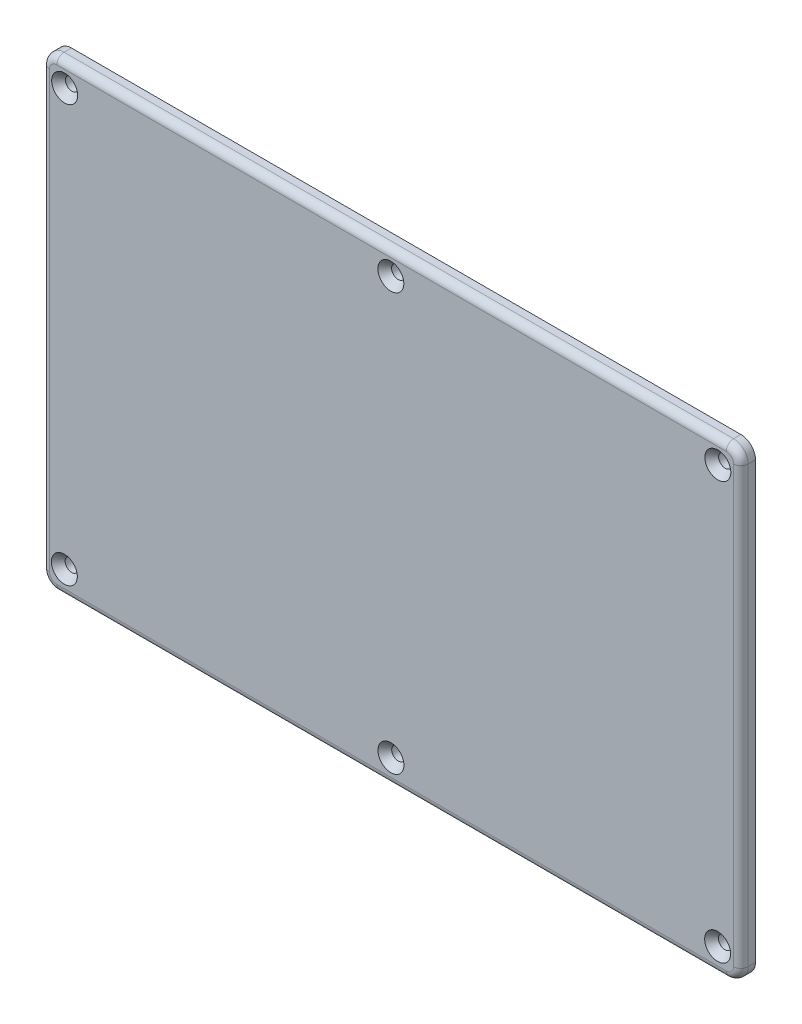
ISO-10303-21;
HEADER;
FILE_DESCRIPTION(('STEP AP214'),'2;1');
FILE_NAME('part.step','',(''),(''),'','','');
FILE_SCHEMA(('AUTOMOTIVE_DESIGN { 1 0 10303 214 1 1 1 1 }'));
ENDSEC;
DATA;
#1=APPLICATION_CONTEXT('core data for automotive mechanical design processes');
#2=APPLICATION_PROTOCOL_DEFINITION('international standard','automotive_design',2000,#1);
#3=PRODUCT_CONTEXT('',#1,'mechanical');
#4=PRODUCT('Part','Part','',(#3));
#5=PRODUCT_RELATED_PRODUCT_CATEGORY('part','',(#4));
#6=PRODUCT_DEFINITION_FORMATION('','',#4);
#7=PRODUCT_DEFINITION_CONTEXT('part definition',#1,'design');
#8=PRODUCT_DEFINITION('design','',#6,#7);
#9=PRODUCT_DEFINITION_SHAPE('','',#8);
#10=(LENGTH_UNIT() NAMED_UNIT(*) SI_UNIT(.MILLI.,.METRE.));
#11=(NAMED_UNIT(*) PLANE_ANGLE_UNIT() SI_UNIT($,.RADIAN.));
#12=(NAMED_UNIT(*) SI_UNIT($,.STERADIAN.) SOLID_ANGLE_UNIT());
#13=UNCERTAINTY_MEASURE_WITH_UNIT(LENGTH_MEASURE(1.E-05),#10,'distance_accuracy_value','');
#14=(GEOMETRIC_REPRESENTATION_CONTEXT(3) GLOBAL_UNCERTAINTY_ASSIGNED_CONTEXT((#13)) GLOBAL_UNIT_ASSIGNED_CONTEXT((#10,
#11,#12)) REPRESENTATION_CONTEXT('',''));
#15=CARTESIAN_POINT('',(0.,0.,0.));
#16=DIRECTION('',(0.,0.,1.));
#17=DIRECTION('',(1.,0.,0.));
#18=AXIS2_PLACEMENT_3D('',#15,#16,#17);
#19=CARTESIAN_POINT('',(95.5,63.5,4.));
#20=DIRECTION('',(-1.,0.,0.));
#21=DIRECTION('',(0.,-1.,0.));
#22=AXIS2_PLACEMENT_3D('',#19,#20,#21);
#23=PLANE('',#22);
#24=DIRECTION('',(0.,0.,-1.));
#25=VECTOR('',#24,1.);
#26=CARTESIAN_POINT('',(95.5,59.5,4.));
#27=LINE('',#26,#25);
#28=CARTESIAN_POINT('',(95.5,59.5,0.));
#29=VERTEX_POINT('',#28);
#30=CARTESIAN_POINT('',(95.5,59.5,2.));
#31=VERTEX_POINT('',#30);
#32=EDGE_CURVE('E232',#29,#31,#27,.F.);
#33=ORIENTED_EDGE('',*,*,#32,.T.);
#34=DIRECTION('',(0.,1.,0.));
#35=VECTOR('',#34,1.);
#36=CARTESIAN_POINT('',(95.5,-59.5,2.));
#37=LINE('',#36,#35);
#38=CARTESIAN_POINT('',(95.5,-59.5,2.));
#39=VERTEX_POINT('',#38);
#40=EDGE_CURVE('E66',#31,#39,#37,.F.);
#41=ORIENTED_EDGE('',*,*,#40,.T.);
#42=DIRECTION('',(0.,0.,-1.));
#43=VECTOR('',#42,1.);
#44=CARTESIAN_POINT('',(95.5,-59.5,4.));
#45=LINE('',#44,#43);
#46=CARTESIAN_POINT('',(95.5,-59.5,0.));
#47=VERTEX_POINT('',#46);
#48=EDGE_CURVE('E229',#39,#47,#45,.T.);
#49=ORIENTED_EDGE('',*,*,#48,.T.);
#50=DIRECTION('',(0.,1.,0.));
#51=VECTOR('',#50,1.);
#52=CARTESIAN_POINT('',(95.5,63.5,0.));
#53=LINE('',#52,#51);
#54=EDGE_CURVE('E171',#47,#29,#53,.T.);
#55=ORIENTED_EDGE('',*,*,#54,.T.);
#56=EDGE_LOOP('',(#33,#41,#49,#55));
#57=FACE_BOUND('',#56,.T.);
#58=ADVANCED_FACE('F41',(#57),#23,.F.);
#59=CARTESIAN_POINT('',(-95.5,63.5,4.));
#60=DIRECTION('',(0.,-1.,0.));
#61=DIRECTION('',(0.,0.,-1.));
#62=AXIS2_PLACEMENT_3D('',#59,#60,#61);
#63=PLANE('',#62);
#64=DIRECTION('',(0.,0.,-1.));
#65=VECTOR('',#64,1.);
#66=CARTESIAN_POINT('',(-91.5,63.5,4.));
#67=LINE('',#66,#65);
#68=CARTESIAN_POINT('',(-91.5,63.5,0.));
#69=VERTEX_POINT('',#68);
#70=CARTESIAN_POINT('',(-91.5,63.5,2.));
#71=VERTEX_POINT('',#70);
#72=EDGE_CURVE('E152',#69,#71,#67,.F.);
#73=ORIENTED_EDGE('',*,*,#72,.T.);
#74=DIRECTION('',(-1.,0.,0.));
#75=VECTOR('',#74,1.);
#76=CARTESIAN_POINT('',(91.5,63.5,2.));
#77=LINE('',#76,#75);
#78=CARTESIAN_POINT('',(91.5,63.5,2.));
#79=VERTEX_POINT('',#78);
#80=EDGE_CURVE('E269',#71,#79,#77,.F.);
#81=ORIENTED_EDGE('',*,*,#80,.T.);
#82=DIRECTION('',(0.,0.,-1.));
#83=VECTOR('',#82,1.);
#84=CARTESIAN_POINT('',(91.5,63.5,4.));
#85=LINE('',#84,#83);
#86=CARTESIAN_POINT('',(91.5,63.5,0.));
#87=VERTEX_POINT('',#86);
#88=EDGE_CURVE('E157',#79,#87,#85,.T.);
#89=ORIENTED_EDGE('',*,*,#88,.T.);
#90=DIRECTION('',(-1.,0.,0.));
#91=VECTOR('',#90,1.);
#92=CARTESIAN_POINT('',(-95.5,63.5,0.));
#93=LINE('',#92,#91);
#94=EDGE_CURVE('E165',#87,#69,#93,.T.);
#95=ORIENTED_EDGE('',*,*,#94,.T.);
#96=EDGE_LOOP('',(#73,#81,#89,#95));
#97=FACE_BOUND('',#96,.T.);
#98=ADVANCED_FACE('F393',(#97),#63,.F.);
#99=CARTESIAN_POINT('',(-95.5,63.5,4.));
#100=DIRECTION('',(1.,0.,0.));
#101=DIRECTION('',(0.,1.,0.));
#102=AXIS2_PLACEMENT_3D('',#99,#100,#101);
#103=PLANE('',#102);
#104=DIRECTION('',(0.,0.,-1.));
#105=VECTOR('',#104,1.);
#106=CARTESIAN_POINT('',(-95.5,-59.5,4.));
#107=LINE('',#106,#105);
#108=CARTESIAN_POINT('',(-95.5,-59.5,0.));
#109=VERTEX_POINT('',#108);
#110=CARTESIAN_POINT('',(-95.5,-59.5,2.));
#111=VERTEX_POINT('',#110);
#112=EDGE_CURVE('E146',#109,#111,#107,.F.);
#113=ORIENTED_EDGE('',*,*,#112,.T.);
#114=DIRECTION('',(0.,-1.,0.));
#115=VECTOR('',#114,1.);
#116=CARTESIAN_POINT('',(-95.5,59.5,2.));
#117=LINE('',#116,#115);
#118=CARTESIAN_POINT('',(-95.5,59.5,2.));
#119=VERTEX_POINT('',#118);
#120=EDGE_CURVE('E141',#111,#119,#117,.F.);
#121=ORIENTED_EDGE('',*,*,#120,.T.);
#122=DIRECTION('',(0.,0.,-1.));
#123=VECTOR('',#122,1.);
#124=CARTESIAN_POINT('',(-95.5,59.5,4.));
#125=LINE('',#124,#123);
#126=CARTESIAN_POINT('',(-95.5,59.5,0.));
#127=VERTEX_POINT('',#126);
#128=EDGE_CURVE('E133',#119,#127,#125,.T.);
#129=ORIENTED_EDGE('',*,*,#128,.T.);
#130=DIRECTION('',(0.,-1.,0.));
#131=VECTOR('',#130,1.);
#132=CARTESIAN_POINT('',(-95.5,63.5,0.));
#133=LINE('',#132,#131);
#134=EDGE_CURVE('E138',#127,#109,#133,.T.);
#135=ORIENTED_EDGE('',*,*,#134,.T.);
#136=EDGE_LOOP('',(#113,#121,#129,#135));
#137=FACE_BOUND('',#136,.T.);
#138=ADVANCED_FACE('F136',(#137),#103,.F.);
#139=CARTESIAN_POINT('',(-95.5,-63.5,4.));
#140=DIRECTION('',(0.,1.,0.));
#141=DIRECTION('',(0.,0.,1.));
#142=AXIS2_PLACEMENT_3D('',#139,#140,#141);
#143=PLANE('',#142);
#144=DIRECTION('',(0.,0.,-1.));
#145=VECTOR('',#144,1.);
#146=CARTESIAN_POINT('',(91.5,-63.5,4.));
#147=LINE('',#146,#145);
#148=CARTESIAN_POINT('',(91.5,-63.5,0.));
#149=VERTEX_POINT('',#148);
#150=CARTESIAN_POINT('',(91.5,-63.5,2.));
#151=VERTEX_POINT('',#150);
#152=EDGE_CURVE('E223',#149,#151,#147,.F.);
#153=ORIENTED_EDGE('',*,*,#152,.T.);
#154=DIRECTION('',(1.,0.,0.));
#155=VECTOR('',#154,1.);
#156=CARTESIAN_POINT('',(-91.5,-63.5,2.));
#157=LINE('',#156,#155);
#158=CARTESIAN_POINT('',(-91.5,-63.5,2.));
#159=VERTEX_POINT('',#158);
#160=EDGE_CURVE('E11',#151,#159,#157,.F.);
#161=ORIENTED_EDGE('',*,*,#160,.T.);
#162=DIRECTION('',(0.,0.,-1.));
#163=VECTOR('',#162,1.);
#164=CARTESIAN_POINT('',(-91.5,-63.5,4.));
#165=LINE('',#164,#163);
#166=CARTESIAN_POINT('',(-91.5,-63.5,0.));
#167=VERTEX_POINT('',#166);
#168=EDGE_CURVE('E226',#159,#167,#165,.T.);
#169=ORIENTED_EDGE('',*,*,#168,.T.);
#170=DIRECTION('',(1.,0.,0.));
#171=VECTOR('',#170,1.);
#172=CARTESIAN_POINT('',(-95.5,-63.5,0.));
#173=LINE('',#172,#171);
#174=EDGE_CURVE('E164',#167,#149,#173,.T.);
#175=ORIENTED_EDGE('',*,*,#174,.T.);
#176=EDGE_LOOP('',(#153,#161,#169,#175));
#177=FACE_BOUND('',#176,.T.);
#178=ADVANCED_FACE('F376',(#177),#143,.F.);
#179=CARTESIAN_POINT('',(0.,0.,4.));
#180=DIRECTION('',(0.,0.,1.));
#181=DIRECTION('',(1.,0.,0.));
#182=AXIS2_PLACEMENT_3D('',#179,#180,#181);
#183=PLANE('',#182);
#184=DIRECTION('',(0.,-1.,0.));
#185=VECTOR('',#184,1.);
#186=CARTESIAN_POINT('',(-93.5,-59.5,4.));
#187=LINE('',#186,#185);
#188=CARTESIAN_POINT('',(-93.5,59.5,4.));
#189=VERTEX_POINT('',#188);
#190=CARTESIAN_POINT('',(-93.5,-59.5,4.));
#191=VERTEX_POINT('',#190);
#192=EDGE_CURVE('E253',#189,#191,#187,.T.);
#193=ORIENTED_EDGE('',*,*,#192,.T.);
#194=CARTESIAN_POINT('',(-91.5,-59.5,4.));
#195=DIRECTION('',(0.,0.,1.));
#196=DIRECTION('',(1.,0.,0.));
#197=AXIS2_PLACEMENT_3D('',#194,#195,#196);
#198=CIRCLE('',#197,2.);
#199=CARTESIAN_POINT('',(-91.5,-61.5,4.));
#200=VERTEX_POINT('',#199);
#201=EDGE_CURVE('E256',#191,#200,#198,.T.);
#202=ORIENTED_EDGE('',*,*,#201,.T.);
#203=DIRECTION('',(1.,0.,0.));
#204=VECTOR('',#203,1.);
#205=CARTESIAN_POINT('',(91.5,-61.5,4.));
#206=LINE('',#205,#204);
#207=CARTESIAN_POINT('',(91.5,-61.5,4.));
#208=VERTEX_POINT('',#207);
#209=EDGE_CURVE('E235',#200,#208,#206,.T.);
#210=ORIENTED_EDGE('',*,*,#209,.T.);
#211=CARTESIAN_POINT('',(91.5,-59.5,4.));
#212=DIRECTION('',(0.,0.,1.));
#213=DIRECTION('',(1.,0.,0.));
#214=AXIS2_PLACEMENT_3D('',#211,#212,#213);
#215=CIRCLE('',#214,2.);
#216=CARTESIAN_POINT('',(93.5,-59.5,4.));
#217=VERTEX_POINT('',#216);
#218=EDGE_CURVE('E238',#208,#217,#215,.T.);
#219=ORIENTED_EDGE('',*,*,#218,.T.);
#220=DIRECTION('',(0.,1.,0.));
#221=VECTOR('',#220,1.);
#222=CARTESIAN_POINT('',(93.5,59.5,4.));
#223=LINE('',#222,#221);
#224=CARTESIAN_POINT('',(93.5,59.5,4.));
#225=VERTEX_POINT('',#224);
#226=EDGE_CURVE('E241',#217,#225,#223,.T.);
#227=ORIENTED_EDGE('',*,*,#226,.T.);
#228=CARTESIAN_POINT('',(91.5,59.5,4.));
#229=DIRECTION('',(0.,0.,1.));
#230=DIRECTION('',(1.,0.,0.));
#231=AXIS2_PLACEMENT_3D('',#228,#229,#230);
#232=CIRCLE('',#231,2.);
#233=CARTESIAN_POINT('',(91.5,61.5,4.));
#234=VERTEX_POINT('',#233);
#235=EDGE_CURVE('E244',#225,#234,#232,.T.);
#236=ORIENTED_EDGE('',*,*,#235,.T.);
#237=DIRECTION('',(-1.,0.,0.));
#238=VECTOR('',#237,1.);
#239=CARTESIAN_POINT('',(-91.5,61.5,4.));
#240=LINE('',#239,#238);
#241=CARTESIAN_POINT('',(-91.5,61.5,4.));
#242=VERTEX_POINT('',#241);
#243=EDGE_CURVE('E247',#234,#242,#240,.T.);
#244=ORIENTED_EDGE('',*,*,#243,.T.);
#245=CARTESIAN_POINT('',(-91.5,59.5,4.));
#246=DIRECTION('',(0.,0.,1.));
#247=DIRECTION('',(1.,0.,0.));
#248=AXIS2_PLACEMENT_3D('',#245,#246,#247);
#249=CIRCLE('',#248,2.);
#250=EDGE_CURVE('E250',#242,#189,#249,.T.);
#251=ORIENTED_EDGE('',*,*,#250,.T.);
#252=EDGE_LOOP('',(#193,#202,#210,#219,#227,#236,#244,#251));
#253=FACE_BOUND('',#252,.T.);
#254=CARTESIAN_POINT('',(-89.3585629023435,57.0955798056189,4.));
#255=DIRECTION('',(0.,0.,1.));
#256=DIRECTION('',(1.,0.,0.));
#257=AXIS2_PLACEMENT_3D('',#254,#255,#256);
#258=CIRCLE('',#257,3.55);
#259=CARTESIAN_POINT('',(-85.8085629023435,57.0955798056189,4.));
#260=VERTEX_POINT('',#259);
#261=EDGE_CURVE('E308',#260,#260,#258,.T.);
#262=ORIENTED_EDGE('',*,*,#261,.F.);
#263=EDGE_LOOP('',(#262));
#264=FACE_BOUND('',#263,.T.);
#265=CARTESIAN_POINT('',(-0.19173029885108,57.1256881937207,4.));
#266=DIRECTION('',(0.,0.,1.));
#267=DIRECTION('',(1.,0.,0.));
#268=AXIS2_PLACEMENT_3D('',#265,#266,#267);
#269=CIRCLE('',#268,3.55);
#270=CARTESIAN_POINT('',(3.35826970114892,57.1256881937207,4.));
#271=VERTEX_POINT('',#270);
#272=EDGE_CURVE('E208',#271,#271,#269,.T.);
#273=ORIENTED_EDGE('',*,*,#272,.F.);
#274=EDGE_LOOP('',(#273));
#275=FACE_BOUND('',#274,.T.);
#276=CARTESIAN_POINT('',(89.2052171585333,57.1455159036048,4.));
#277=DIRECTION('',(0.,0.,1.));
#278=DIRECTION('',(1.,0.,0.));
#279=AXIS2_PLACEMENT_3D('',#276,#277,#278);
#280=CIRCLE('',#279,3.55);
#281=CARTESIAN_POINT('',(92.7552171585333,57.1455159036048,4.));
#282=VERTEX_POINT('',#281);
#283=EDGE_CURVE('E202',#282,#282,#280,.T.);
#284=ORIENTED_EDGE('',*,*,#283,.F.);
#285=EDGE_LOOP('',(#284));
#286=FACE_BOUND('',#285,.T.);
#287=CARTESIAN_POINT('',(89.1478229110666,-56.8820145222905,4.));
#288=DIRECTION('',(0.,0.,1.));
#289=DIRECTION('',(1.,0.,0.));
#290=AXIS2_PLACEMENT_3D('',#287,#288,#289);
#291=CIRCLE('',#290,3.55);
#292=CARTESIAN_POINT('',(92.6978229110666,-56.8820145222905,4.));
#293=VERTEX_POINT('',#292);
#294=EDGE_CURVE('E196',#293,#293,#291,.T.);
#295=ORIENTED_EDGE('',*,*,#294,.F.);
#296=EDGE_LOOP('',(#295));
#297=FACE_BOUND('',#296,.T.);
#298=CARTESIAN_POINT('',(-0.160812966057601,-56.856544367549,4.));
#299=DIRECTION('',(0.,0.,1.));
#300=DIRECTION('',(1.,0.,0.));
#301=AXIS2_PLACEMENT_3D('',#298,#299,#300);
#302=CIRCLE('',#301,3.55);
#303=CARTESIAN_POINT('',(3.3891870339424,-56.856544367549,4.));
#304=VERTEX_POINT('',#303);
#305=EDGE_CURVE('E190',#304,#304,#302,.T.);
#306=ORIENTED_EDGE('',*,*,#305,.F.);
#307=EDGE_LOOP('',(#306));
#308=FACE_BOUND('',#307,.T.);
#309=CARTESIAN_POINT('',(-89.4443328690032,-56.8623922152166,4.));
#310=DIRECTION('',(0.,0.,1.));
#311=DIRECTION('',(1.,0.,0.));
#312=AXIS2_PLACEMENT_3D('',#309,#310,#311);
#313=CIRCLE('',#312,3.55);
#314=CARTESIAN_POINT('',(-85.8943328690032,-56.8623922152166,4.));
#315=VERTEX_POINT('',#314);
#316=EDGE_CURVE('E184',#315,#315,#313,.T.);
#317=ORIENTED_EDGE('',*,*,#316,.F.);
#318=EDGE_LOOP('',(#317));
#319=FACE_BOUND('',#318,.T.);
#320=ADVANCED_FACE('F396',(#253,#264,#275,#286,#297,#308,#319),#183,.T.);
#321=CARTESIAN_POINT('',(0.,0.,0.));
#322=DIRECTION('',(0.,0.,1.));
#323=DIRECTION('',(1.,0.,0.));
#324=AXIS2_PLACEMENT_3D('',#321,#322,#323);
#325=PLANE('',#324);
#326=CARTESIAN_POINT('',(-89.3585629023435,57.0955798056189,0.));
#327=DIRECTION('',(0.,0.,1.));
#328=DIRECTION('',(1.,0.,0.));
#329=AXIS2_PLACEMENT_3D('',#326,#327,#328);
#330=CIRCLE('',#329,1.8);
#331=CARTESIAN_POINT('',(-87.5585629023435,57.0955798056189,0.));
#332=VERTEX_POINT('',#331);
#333=EDGE_CURVE('E204',#332,#332,#330,.T.);
#334=ORIENTED_EDGE('',*,*,#333,.T.);
#335=EDGE_LOOP('',(#334));
#336=FACE_BOUND('',#335,.T.);
#337=CARTESIAN_POINT('',(-0.19173029885108,57.1256881937207,0.));
#338=DIRECTION('',(0.,0.,1.));
#339=DIRECTION('',(1.,0.,0.));
#340=AXIS2_PLACEMENT_3D('',#337,#338,#339);
#341=CIRCLE('',#340,1.8);
#342=CARTESIAN_POINT('',(1.60826970114892,57.1256881937207,0.));
#343=VERTEX_POINT('',#342);
#344=EDGE_CURVE('E198',#343,#343,#341,.T.);
#345=ORIENTED_EDGE('',*,*,#344,.T.);
#346=EDGE_LOOP('',(#345));
#347=FACE_BOUND('',#346,.T.);
#348=CARTESIAN_POINT('',(89.2052171585333,57.1455159036048,0.));
#349=DIRECTION('',(0.,0.,1.));
#350=DIRECTION('',(1.,0.,0.));
#351=AXIS2_PLACEMENT_3D('',#348,#349,#350);
#352=CIRCLE('',#351,1.8);
#353=CARTESIAN_POINT('',(91.0052171585333,57.1455159036048,0.));
#354=VERTEX_POINT('',#353);
#355=EDGE_CURVE('E192',#354,#354,#352,.T.);
#356=ORIENTED_EDGE('',*,*,#355,.T.);
#357=EDGE_LOOP('',(#356));
#358=FACE_BOUND('',#357,.T.);
#359=CARTESIAN_POINT('',(89.1478229110666,-56.8820145222905,0.));
#360=DIRECTION('',(0.,0.,1.));
#361=DIRECTION('',(1.,0.,0.));
#362=AXIS2_PLACEMENT_3D('',#359,#360,#361);
#363=CIRCLE('',#362,1.8);
#364=CARTESIAN_POINT('',(90.9478229110666,-56.8820145222905,0.));
#365=VERTEX_POINT('',#364);
#366=EDGE_CURVE('E186',#365,#365,#363,.T.);
#367=ORIENTED_EDGE('',*,*,#366,.T.);
#368=EDGE_LOOP('',(#367));
#369=FACE_BOUND('',#368,.T.);
#370=CARTESIAN_POINT('',(-0.160812966057601,-56.856544367549,0.));
#371=DIRECTION('',(0.,0.,1.));
#372=DIRECTION('',(1.,0.,0.));
#373=AXIS2_PLACEMENT_3D('',#370,#371,#372);
#374=CIRCLE('',#373,1.8);
#375=CARTESIAN_POINT('',(1.6391870339424,-56.856544367549,0.));
#376=VERTEX_POINT('',#375);
#377=EDGE_CURVE('E180',#376,#376,#374,.T.);
#378=ORIENTED_EDGE('',*,*,#377,.T.);
#379=EDGE_LOOP('',(#378));
#380=FACE_BOUND('',#379,.T.);
#381=CARTESIAN_POINT('',(-89.4443328690032,-56.8623922152166,0.));
#382=DIRECTION('',(0.,0.,1.));
#383=DIRECTION('',(1.,0.,0.));
#384=AXIS2_PLACEMENT_3D('',#381,#382,#383);
#385=CIRCLE('',#384,1.8);
#386=CARTESIAN_POINT('',(-87.6443328690032,-56.8623922152166,0.));
#387=VERTEX_POINT('',#386);
#388=EDGE_CURVE('E175',#387,#387,#385,.T.);
#389=ORIENTED_EDGE('',*,*,#388,.T.);
#390=EDGE_LOOP('',(#389));
#391=FACE_BOUND('',#390,.T.);
#392=ORIENTED_EDGE('',*,*,#134,.F.);
#393=CARTESIAN_POINT('',(-91.5,59.5,0.));
#394=DIRECTION('',(0.,0.,1.));
#395=DIRECTION('',(1.,0.,0.));
#396=AXIS2_PLACEMENT_3D('',#393,#394,#395);
#397=CIRCLE('',#396,4.);
#398=EDGE_CURVE('E149',#127,#69,#397,.F.);
#399=ORIENTED_EDGE('',*,*,#398,.T.);
#400=ORIENTED_EDGE('',*,*,#94,.F.);
#401=CARTESIAN_POINT('',(91.5,59.5,0.));
#402=DIRECTION('',(0.,0.,1.));
#403=DIRECTION('',(1.,0.,0.));
#404=AXIS2_PLACEMENT_3D('',#401,#402,#403);
#405=CIRCLE('',#404,4.);
#406=EDGE_CURVE('E214',#87,#29,#405,.F.);
#407=ORIENTED_EDGE('',*,*,#406,.T.);
#408=ORIENTED_EDGE('',*,*,#54,.F.);
#409=CARTESIAN_POINT('',(91.5,-59.5,0.));
#410=DIRECTION('',(0.,0.,1.));
#411=DIRECTION('',(1.,0.,0.));
#412=AXIS2_PLACEMENT_3D('',#409,#410,#411);
#413=CIRCLE('',#412,4.);
#414=EDGE_CURVE('E145',#47,#149,#413,.F.);
#415=ORIENTED_EDGE('',*,*,#414,.T.);
#416=ORIENTED_EDGE('',*,*,#174,.F.);
#417=CARTESIAN_POINT('',(-91.5,-59.5,0.));
#418=DIRECTION('',(0.,0.,1.));
#419=DIRECTION('',(1.,0.,0.));
#420=AXIS2_PLACEMENT_3D('',#417,#418,#419);
#421=CIRCLE('',#420,4.);
#422=EDGE_CURVE('E158',#167,#109,#421,.F.);
#423=ORIENTED_EDGE('',*,*,#422,.T.);
#424=EDGE_LOOP('',(#392,#399,#400,#407,#408,#415,#416,#423));
#425=FACE_BOUND('',#424,.T.);
#426=ADVANCED_FACE('F160',(#336,#347,#358,#369,#380,#391,#425),#325,.F.);
#427=CARTESIAN_POINT('',(-89.4443328690032,-56.8623922152166,4.));
#428=DIRECTION('',(0.,0.,1.));
#429=DIRECTION('',(1.,0.,0.));
#430=AXIS2_PLACEMENT_3D('',#427,#428,#429);
#431=CYLINDRICAL_SURFACE('',#430,1.8);
#432=CARTESIAN_POINT('',(-89.4443328690032,-56.8623922152166,1.98685528736325));
#433=DIRECTION('',(0.,0.,1.));
#434=DIRECTION('',(1.,0.,0.));
#435=AXIS2_PLACEMENT_3D('',#432,#433,#434);
#436=CIRCLE('',#435,1.8);
#437=CARTESIAN_POINT('',(-87.6443328690032,-56.8623922152166,1.98685528736325));
#438=VERTEX_POINT('',#437);
#439=EDGE_CURVE('E179',#438,#438,#436,.T.);
#440=ORIENTED_EDGE('',*,*,#439,.T.);
#441=EDGE_LOOP('',(#440));
#442=FACE_BOUND('',#441,.T.);
#443=ORIENTED_EDGE('',*,*,#388,.F.);
#444=EDGE_LOOP('',(#443));
#445=FACE_BOUND('',#444,.T.);
#446=ADVANCED_FACE('F414',(#442,#445),#431,.F.);
#447=CARTESIAN_POINT('',(-89.4443328690032,-56.8623922152166,4.));
#448=DIRECTION('',(0.,0.,1.));
#449=DIRECTION('',(1.,0.,0.));
#450=AXIS2_PLACEMENT_3D('',#447,#448,#449);
#451=CONICAL_SURFACE('',#450,3.55,0.715584993317678);
#452=ORIENTED_EDGE('',*,*,#439,.F.);
#453=EDGE_LOOP('',(#452));
#454=FACE_BOUND('',#453,.T.);
#455=ORIENTED_EDGE('',*,*,#316,.T.);
#456=EDGE_LOOP('',(#455));
#457=FACE_BOUND('',#456,.T.);
#458=ADVANCED_FACE('F411',(#454,#457),#451,.F.);
#459=CARTESIAN_POINT('',(-0.160812966057601,-56.856544367549,4.));
#460=DIRECTION('',(0.,0.,1.));
#461=DIRECTION('',(1.,0.,0.));
#462=AXIS2_PLACEMENT_3D('',#459,#460,#461);
#463=CYLINDRICAL_SURFACE('',#462,1.8);
#464=CARTESIAN_POINT('',(-0.160812966057601,-56.856544367549,1.98685528736325));
#465=DIRECTION('',(0.,0.,1.));
#466=DIRECTION('',(1.,0.,0.));
#467=AXIS2_PLACEMENT_3D('',#464,#465,#466);
#468=CIRCLE('',#467,1.8);
#469=CARTESIAN_POINT('',(1.6391870339424,-56.856544367549,1.98685528736325));
#470=VERTEX_POINT('',#469);
#471=EDGE_CURVE('E185',#470,#470,#468,.T.);
#472=ORIENTED_EDGE('',*,*,#471,.T.);
#473=EDGE_LOOP('',(#472));
#474=FACE_BOUND('',#473,.T.);
#475=ORIENTED_EDGE('',*,*,#377,.F.);
#476=EDGE_LOOP('',(#475));
#477=FACE_BOUND('',#476,.T.);
#478=ADVANCED_FACE('F413',(#474,#477),#463,.F.);
#479=CARTESIAN_POINT('',(-0.160812966057601,-56.856544367549,4.));
#480=DIRECTION('',(0.,0.,1.));
#481=DIRECTION('',(1.,0.,0.));
#482=AXIS2_PLACEMENT_3D('',#479,#480,#481);
#483=CONICAL_SURFACE('',#482,3.55,0.715584993317678);
#484=ORIENTED_EDGE('',*,*,#471,.F.);
#485=EDGE_LOOP('',(#484));
#486=FACE_BOUND('',#485,.T.);
#487=ORIENTED_EDGE('',*,*,#305,.T.);
#488=EDGE_LOOP('',(#487));
#489=FACE_BOUND('',#488,.T.);
#490=ADVANCED_FACE('F421',(#486,#489),#483,.F.);
#491=CARTESIAN_POINT('',(89.1478229110666,-56.8820145222905,4.));
#492=DIRECTION('',(0.,0.,1.));
#493=DIRECTION('',(1.,0.,0.));
#494=AXIS2_PLACEMENT_3D('',#491,#492,#493);
#495=CYLINDRICAL_SURFACE('',#494,1.8);
#496=CARTESIAN_POINT('',(89.1478229110666,-56.8820145222905,1.98685528736325));
#497=DIRECTION('',(0.,0.,1.));
#498=DIRECTION('',(1.,0.,0.));
#499=AXIS2_PLACEMENT_3D('',#496,#497,#498);
#500=CIRCLE('',#499,1.8);
#501=CARTESIAN_POINT('',(90.9478229110666,-56.8820145222905,1.98685528736325));
#502=VERTEX_POINT('',#501);
#503=EDGE_CURVE('E191',#502,#502,#500,.T.);
#504=ORIENTED_EDGE('',*,*,#503,.T.);
#505=EDGE_LOOP('',(#504));
#506=FACE_BOUND('',#505,.T.);
#507=ORIENTED_EDGE('',*,*,#366,.F.);
#508=EDGE_LOOP('',(#507));
#509=FACE_BOUND('',#508,.T.);
#510=ADVANCED_FACE('F533',(#506,#509),#495,.F.);
#511=CARTESIAN_POINT('',(89.1478229110666,-56.8820145222905,4.));
#512=DIRECTION('',(0.,0.,1.));
#513=DIRECTION('',(1.,0.,0.));
#514=AXIS2_PLACEMENT_3D('',#511,#512,#513);
#515=CONICAL_SURFACE('',#514,3.55,0.715584993317678);
#516=ORIENTED_EDGE('',*,*,#503,.F.);
#517=EDGE_LOOP('',(#516));
#518=FACE_BOUND('',#517,.T.);
#519=ORIENTED_EDGE('',*,*,#294,.T.);
#520=EDGE_LOOP('',(#519));
#521=FACE_BOUND('',#520,.T.);
#522=ADVANCED_FACE('F525',(#518,#521),#515,.F.);
#523=CARTESIAN_POINT('',(89.2052171585333,57.1455159036048,4.));
#524=DIRECTION('',(0.,0.,1.));
#525=DIRECTION('',(1.,0.,0.));
#526=AXIS2_PLACEMENT_3D('',#523,#524,#525);
#527=CYLINDRICAL_SURFACE('',#526,1.8);
#528=CARTESIAN_POINT('',(89.2052171585333,57.1455159036048,1.98685528736325));
#529=DIRECTION('',(0.,0.,1.));
#530=DIRECTION('',(1.,0.,0.));
#531=AXIS2_PLACEMENT_3D('',#528,#529,#530);
#532=CIRCLE('',#531,1.8);
#533=CARTESIAN_POINT('',(91.0052171585333,57.1455159036048,1.98685528736325));
#534=VERTEX_POINT('',#533);
#535=EDGE_CURVE('E197',#534,#534,#532,.T.);
#536=ORIENTED_EDGE('',*,*,#535,.T.);
#537=EDGE_LOOP('',(#536));
#538=FACE_BOUND('',#537,.T.);
#539=ORIENTED_EDGE('',*,*,#355,.F.);
#540=EDGE_LOOP('',(#539));
#541=FACE_BOUND('',#540,.T.);
#542=ADVANCED_FACE('F517',(#538,#541),#527,.F.);
#543=CARTESIAN_POINT('',(89.2052171585333,57.1455159036048,4.));
#544=DIRECTION('',(0.,0.,1.));
#545=DIRECTION('',(1.,0.,0.));
#546=AXIS2_PLACEMENT_3D('',#543,#544,#545);
#547=CONICAL_SURFACE('',#546,3.55,0.715584993317678);
#548=ORIENTED_EDGE('',*,*,#535,.F.);
#549=EDGE_LOOP('',(#548));
#550=FACE_BOUND('',#549,.T.);
#551=ORIENTED_EDGE('',*,*,#283,.T.);
#552=EDGE_LOOP('',(#551));
#553=FACE_BOUND('',#552,.T.);
#554=ADVANCED_FACE('F509',(#550,#553),#547,.F.);
#555=CARTESIAN_POINT('',(-0.19173029885108,57.1256881937207,4.));
#556=DIRECTION('',(0.,0.,1.));
#557=DIRECTION('',(1.,0.,0.));
#558=AXIS2_PLACEMENT_3D('',#555,#556,#557);
#559=CYLINDRICAL_SURFACE('',#558,1.8);
#560=CARTESIAN_POINT('',(-0.19173029885108,57.1256881937207,1.98685528736325));
#561=DIRECTION('',(0.,0.,1.));
#562=DIRECTION('',(1.,0.,0.));
#563=AXIS2_PLACEMENT_3D('',#560,#561,#562);
#564=CIRCLE('',#563,1.8);
#565=CARTESIAN_POINT('',(1.60826970114892,57.1256881937207,1.98685528736325));
#566=VERTEX_POINT('',#565);
#567=EDGE_CURVE('E203',#566,#566,#564,.T.);
#568=ORIENTED_EDGE('',*,*,#567,.T.);
#569=EDGE_LOOP('',(#568));
#570=FACE_BOUND('',#569,.T.);
#571=ORIENTED_EDGE('',*,*,#344,.F.);
#572=EDGE_LOOP('',(#571));
#573=FACE_BOUND('',#572,.T.);
#574=ADVANCED_FACE('F501',(#570,#573),#559,.F.);
#575=CARTESIAN_POINT('',(-0.19173029885108,57.1256881937207,4.));
#576=DIRECTION('',(0.,0.,1.));
#577=DIRECTION('',(1.,0.,0.));
#578=AXIS2_PLACEMENT_3D('',#575,#576,#577);
#579=CONICAL_SURFACE('',#578,3.55,0.715584993317678);
#580=ORIENTED_EDGE('',*,*,#567,.F.);
#581=EDGE_LOOP('',(#580));
#582=FACE_BOUND('',#581,.T.);
#583=ORIENTED_EDGE('',*,*,#272,.T.);
#584=EDGE_LOOP('',(#583));
#585=FACE_BOUND('',#584,.T.);
#586=ADVANCED_FACE('F493',(#582,#585),#579,.F.);
#587=CARTESIAN_POINT('',(-89.3585629023435,57.0955798056189,4.));
#588=DIRECTION('',(0.,0.,1.));
#589=DIRECTION('',(1.,0.,0.));
#590=AXIS2_PLACEMENT_3D('',#587,#588,#589);
#591=CYLINDRICAL_SURFACE('',#590,1.8);
#592=CARTESIAN_POINT('',(-89.3585629023435,57.0955798056189,1.98685528736325));
#593=DIRECTION('',(0.,0.,1.));
#594=DIRECTION('',(1.,0.,0.));
#595=AXIS2_PLACEMENT_3D('',#592,#593,#594);
#596=CIRCLE('',#595,1.8);
#597=CARTESIAN_POINT('',(-87.5585629023435,57.0955798056189,1.98685528736325));
#598=VERTEX_POINT('',#597);
#599=EDGE_CURVE('E209',#598,#598,#596,.T.);
#600=ORIENTED_EDGE('',*,*,#599,.T.);
#601=EDGE_LOOP('',(#600));
#602=FACE_BOUND('',#601,.T.);
#603=ORIENTED_EDGE('',*,*,#333,.F.);
#604=EDGE_LOOP('',(#603));
#605=FACE_BOUND('',#604,.T.);
#606=ADVANCED_FACE('F485',(#602,#605),#591,.F.);
#607=CARTESIAN_POINT('',(-89.3585629023435,57.0955798056189,4.));
#608=DIRECTION('',(0.,0.,1.));
#609=DIRECTION('',(1.,0.,0.));
#610=AXIS2_PLACEMENT_3D('',#607,#608,#609);
#611=CONICAL_SURFACE('',#610,3.55,0.715584993317678);
#612=ORIENTED_EDGE('',*,*,#599,.F.);
#613=EDGE_LOOP('',(#612));
#614=FACE_BOUND('',#613,.T.);
#615=ORIENTED_EDGE('',*,*,#261,.T.);
#616=EDGE_LOOP('',(#615));
#617=FACE_BOUND('',#616,.T.);
#618=ADVANCED_FACE('F438',(#614,#617),#611,.F.);
#619=CARTESIAN_POINT('',(-91.5,59.5,4.));
#620=DIRECTION('',(0.,0.,-1.));
#621=DIRECTION('',(-1.,0.,0.));
#622=AXIS2_PLACEMENT_3D('',#619,#620,#621);
#623=CYLINDRICAL_SURFACE('',#622,4.);
#624=ORIENTED_EDGE('',*,*,#128,.F.);
#625=CARTESIAN_POINT('',(-91.5,59.5,2.));
#626=DIRECTION('',(0.,0.,1.));
#627=DIRECTION('',(1.,0.,0.));
#628=AXIS2_PLACEMENT_3D('',#625,#626,#627);
#629=CIRCLE('',#628,4.);
#630=EDGE_CURVE('E266',#119,#71,#629,.F.);
#631=ORIENTED_EDGE('',*,*,#630,.T.);
#632=ORIENTED_EDGE('',*,*,#72,.F.);
#633=ORIENTED_EDGE('',*,*,#398,.F.);
#634=EDGE_LOOP('',(#624,#631,#632,#633));
#635=FACE_BOUND('',#634,.T.);
#636=ADVANCED_FACE('F150',(#635),#623,.T.);
#637=CARTESIAN_POINT('',(-91.5,-59.5,4.));
#638=DIRECTION('',(0.,0.,-1.));
#639=DIRECTION('',(-1.,0.,0.));
#640=AXIS2_PLACEMENT_3D('',#637,#638,#639);
#641=CYLINDRICAL_SURFACE('',#640,4.);
#642=ORIENTED_EDGE('',*,*,#168,.F.);
#643=CARTESIAN_POINT('',(-91.5,-59.5,2.));
#644=DIRECTION('',(0.,0.,1.));
#645=DIRECTION('',(1.,0.,0.));
#646=AXIS2_PLACEMENT_3D('',#643,#644,#645);
#647=CIRCLE('',#646,4.);
#648=EDGE_CURVE('E260',#159,#111,#647,.F.);
#649=ORIENTED_EDGE('',*,*,#648,.T.);
#650=ORIENTED_EDGE('',*,*,#112,.F.);
#651=ORIENTED_EDGE('',*,*,#422,.F.);
#652=EDGE_LOOP('',(#642,#649,#650,#651));
#653=FACE_BOUND('',#652,.T.);
#654=ADVANCED_FACE('F379',(#653),#641,.T.);
#655=CARTESIAN_POINT('',(91.5,59.5,4.));
#656=DIRECTION('',(0.,0.,-1.));
#657=DIRECTION('',(-1.,0.,0.));
#658=AXIS2_PLACEMENT_3D('',#655,#656,#657);
#659=CYLINDRICAL_SURFACE('',#658,4.);
#660=ORIENTED_EDGE('',*,*,#88,.F.);
#661=CARTESIAN_POINT('',(91.5,59.5,2.));
#662=DIRECTION('',(0.,0.,1.));
#663=DIRECTION('',(1.,0.,0.));
#664=AXIS2_PLACEMENT_3D('',#661,#662,#663);
#665=CIRCLE('',#664,4.);
#666=EDGE_CURVE('E272',#79,#31,#665,.F.);
#667=ORIENTED_EDGE('',*,*,#666,.T.);
#668=ORIENTED_EDGE('',*,*,#32,.F.);
#669=ORIENTED_EDGE('',*,*,#406,.F.);
#670=EDGE_LOOP('',(#660,#667,#668,#669));
#671=FACE_BOUND('',#670,.T.);
#672=ADVANCED_FACE('F359',(#671),#659,.T.);
#673=CARTESIAN_POINT('',(91.5,-59.5,4.));
#674=DIRECTION('',(0.,0.,-1.));
#675=DIRECTION('',(-1.,0.,0.));
#676=AXIS2_PLACEMENT_3D('',#673,#674,#675);
#677=CYLINDRICAL_SURFACE('',#676,4.);
#678=ORIENTED_EDGE('',*,*,#48,.F.);
#679=CARTESIAN_POINT('',(91.5,-59.5,2.));
#680=DIRECTION('',(0.,0.,1.));
#681=DIRECTION('',(1.,0.,0.));
#682=AXIS2_PLACEMENT_3D('',#679,#680,#681);
#683=CIRCLE('',#682,4.);
#684=EDGE_CURVE('E51',#39,#151,#683,.F.);
#685=ORIENTED_EDGE('',*,*,#684,.T.);
#686=ORIENTED_EDGE('',*,*,#152,.F.);
#687=ORIENTED_EDGE('',*,*,#414,.F.);
#688=EDGE_LOOP('',(#678,#685,#686,#687));
#689=FACE_BOUND('',#688,.T.);
#690=ADVANCED_FACE('F443',(#689),#677,.T.);
#691=CARTESIAN_POINT('',(91.5,59.5,2.));
#692=DIRECTION('',(0.,0.,1.));
#693=DIRECTION('',(1.,0.,0.));
#694=AXIS2_PLACEMENT_3D('',#691,#692,#693);
#695=DEGENERATE_TOROIDAL_SURFACE('',#694,2.,2.,.T.);
#696=CARTESIAN_POINT('',(93.5,59.5,2.));
#697=DIRECTION('',(0.,-1.,0.));
#698=DIRECTION('',(0.,0.,-1.));
#699=AXIS2_PLACEMENT_3D('',#696,#697,#698);
#700=CIRCLE('',#699,2.);
#701=EDGE_CURVE('E300',#31,#225,#700,.T.);
#702=ORIENTED_EDGE('',*,*,#701,.F.);
#703=ORIENTED_EDGE('',*,*,#666,.F.);
#704=CARTESIAN_POINT('',(91.5,61.5,2.));
#705=DIRECTION('',(-1.,0.,0.));
#706=DIRECTION('',(0.,0.,1.));
#707=AXIS2_PLACEMENT_3D('',#704,#705,#706);
#708=CIRCLE('',#707,2.);
#709=EDGE_CURVE('E45',#234,#79,#708,.T.);
#710=ORIENTED_EDGE('',*,*,#709,.F.);
#711=ORIENTED_EDGE('',*,*,#235,.F.);
#712=EDGE_LOOP('',(#702,#703,#710,#711));
#713=FACE_BOUND('',#712,.T.);
#714=ADVANCED_FACE('F43',(#713),#695,.T.);
#715=CARTESIAN_POINT('',(0.,61.5,2.));
#716=DIRECTION('',(1.,0.,0.));
#717=DIRECTION('',(0.,0.,-1.));
#718=AXIS2_PLACEMENT_3D('',#715,#716,#717);
#719=CYLINDRICAL_SURFACE('',#718,2.);
#720=ORIENTED_EDGE('',*,*,#709,.T.);
#721=ORIENTED_EDGE('',*,*,#80,.F.);
#722=CARTESIAN_POINT('',(-91.5,61.5,2.));
#723=DIRECTION('',(-1.,0.,0.));
#724=DIRECTION('',(0.,0.,1.));
#725=AXIS2_PLACEMENT_3D('',#722,#723,#724);
#726=CIRCLE('',#725,2.);
#727=EDGE_CURVE('E297',#242,#71,#726,.T.);
#728=ORIENTED_EDGE('',*,*,#727,.F.);
#729=ORIENTED_EDGE('',*,*,#243,.F.);
#730=EDGE_LOOP('',(#720,#721,#728,#729));
#731=FACE_BOUND('',#730,.T.);
#732=ADVANCED_FACE('F394',(#731),#719,.T.);
#733=CARTESIAN_POINT('',(93.5,0.,2.));
#734=DIRECTION('',(0.,-1.,0.));
#735=DIRECTION('',(1.,0.,0.));
#736=AXIS2_PLACEMENT_3D('',#733,#734,#735);
#737=CYLINDRICAL_SURFACE('',#736,2.);
#738=ORIENTED_EDGE('',*,*,#701,.T.);
#739=ORIENTED_EDGE('',*,*,#226,.F.);
#740=CARTESIAN_POINT('',(93.5,-59.5,2.));
#741=DIRECTION('',(0.,-1.,0.));
#742=DIRECTION('',(0.,0.,-1.));
#743=AXIS2_PLACEMENT_3D('',#740,#741,#742);
#744=CIRCLE('',#743,2.);
#745=EDGE_CURVE('E293',#39,#217,#744,.T.);
#746=ORIENTED_EDGE('',*,*,#745,.F.);
#747=ORIENTED_EDGE('',*,*,#40,.F.);
#748=EDGE_LOOP('',(#738,#739,#746,#747));
#749=FACE_BOUND('',#748,.T.);
#750=ADVANCED_FACE('F364',(#749),#737,.T.);
#751=CARTESIAN_POINT('',(-91.5,59.5,2.));
#752=DIRECTION('',(0.,0.,1.));
#753=DIRECTION('',(1.,0.,0.));
#754=AXIS2_PLACEMENT_3D('',#751,#752,#753);
#755=DEGENERATE_TOROIDAL_SURFACE('',#754,2.,2.,.T.);
#756=ORIENTED_EDGE('',*,*,#727,.T.);
#757=ORIENTED_EDGE('',*,*,#630,.F.);
#758=CARTESIAN_POINT('',(-93.5,59.5,2.));
#759=DIRECTION('',(0.,-1.,0.));
#760=DIRECTION('',(0.,0.,-1.));
#761=AXIS2_PLACEMENT_3D('',#758,#759,#760);
#762=CIRCLE('',#761,2.);
#763=EDGE_CURVE('E289',#189,#119,#762,.T.);
#764=ORIENTED_EDGE('',*,*,#763,.F.);
#765=ORIENTED_EDGE('',*,*,#250,.F.);
#766=EDGE_LOOP('',(#756,#757,#764,#765));
#767=FACE_BOUND('',#766,.T.);
#768=ADVANCED_FACE('F390',(#767),#755,.T.);
#769=CARTESIAN_POINT('',(91.5,-59.5,2.));
#770=DIRECTION('',(0.,0.,1.));
#771=DIRECTION('',(1.,0.,0.));
#772=AXIS2_PLACEMENT_3D('',#769,#770,#771);
#773=DEGENERATE_TOROIDAL_SURFACE('',#772,2.,2.,.T.);
#774=ORIENTED_EDGE('',*,*,#745,.T.);
#775=ORIENTED_EDGE('',*,*,#218,.F.);
#776=CARTESIAN_POINT('',(91.5,-61.5,2.));
#777=DIRECTION('',(-1.,0.,0.));
#778=DIRECTION('',(0.,0.,1.));
#779=AXIS2_PLACEMENT_3D('',#776,#777,#778);
#780=CIRCLE('',#779,2.);
#781=EDGE_CURVE('E285',#151,#208,#780,.T.);
#782=ORIENTED_EDGE('',*,*,#781,.F.);
#783=ORIENTED_EDGE('',*,*,#684,.F.);
#784=EDGE_LOOP('',(#774,#775,#782,#783));
#785=FACE_BOUND('',#784,.T.);
#786=ADVANCED_FACE('F368',(#785),#773,.T.);
#787=CARTESIAN_POINT('',(-93.5,0.,2.));
#788=DIRECTION('',(0.,1.,0.));
#789=DIRECTION('',(-1.,0.,0.));
#790=AXIS2_PLACEMENT_3D('',#787,#788,#789);
#791=CYLINDRICAL_SURFACE('',#790,2.);
#792=ORIENTED_EDGE('',*,*,#763,.T.);
#793=ORIENTED_EDGE('',*,*,#120,.F.);
#794=CARTESIAN_POINT('',(-93.5,-59.5,2.));
#795=DIRECTION('',(0.,-1.,0.));
#796=DIRECTION('',(0.,0.,-1.));
#797=AXIS2_PLACEMENT_3D('',#794,#795,#796);
#798=CIRCLE('',#797,2.);
#799=EDGE_CURVE('E282',#191,#111,#798,.T.);
#800=ORIENTED_EDGE('',*,*,#799,.F.);
#801=ORIENTED_EDGE('',*,*,#192,.F.);
#802=EDGE_LOOP('',(#792,#793,#800,#801));
#803=FACE_BOUND('',#802,.T.);
#804=ADVANCED_FACE('F386',(#803),#791,.T.);
#805=CARTESIAN_POINT('',(0.,-61.5,2.));
#806=DIRECTION('',(-1.,0.,0.));
#807=DIRECTION('',(0.,0.,1.));
#808=AXIS2_PLACEMENT_3D('',#805,#806,#807);
#809=CYLINDRICAL_SURFACE('',#808,2.);
#810=ORIENTED_EDGE('',*,*,#781,.T.);
#811=ORIENTED_EDGE('',*,*,#209,.F.);
#812=CARTESIAN_POINT('',(-91.5,-61.5,2.));
#813=DIRECTION('',(-1.,0.,0.));
#814=DIRECTION('',(0.,0.,1.));
#815=AXIS2_PLACEMENT_3D('',#812,#813,#814);
#816=CIRCLE('',#815,2.);
#817=EDGE_CURVE('E279',#159,#200,#816,.T.);
#818=ORIENTED_EDGE('',*,*,#817,.F.);
#819=ORIENTED_EDGE('',*,*,#160,.F.);
#820=EDGE_LOOP('',(#810,#811,#818,#819));
#821=FACE_BOUND('',#820,.T.);
#822=ADVANCED_FACE('F373',(#821),#809,.T.);
#823=CARTESIAN_POINT('',(-91.5,-59.5,2.));
#824=DIRECTION('',(0.,0.,1.));
#825=DIRECTION('',(1.,0.,0.));
#826=AXIS2_PLACEMENT_3D('',#823,#824,#825);
#827=DEGENERATE_TOROIDAL_SURFACE('',#826,2.,2.,.T.);
#828=ORIENTED_EDGE('',*,*,#799,.T.);
#829=ORIENTED_EDGE('',*,*,#648,.F.);
#830=ORIENTED_EDGE('',*,*,#817,.T.);
#831=ORIENTED_EDGE('',*,*,#201,.F.);
#832=EDGE_LOOP('',(#828,#829,#830,#831));
#833=FACE_BOUND('',#832,.T.);
#834=ADVANCED_FACE('F381',(#833),#827,.T.);
#835=CLOSED_SHELL('',(#58,#98,#138,#178,#320,#426,#446,#458,#478,#490,#510,#522,#542,#554,#574,
#586,#606,#618,#636,#654,#672,#690,#714,#732,#750,#768,#786,#804,#822,#834));
#836=MANIFOLD_SOLID_BREP('B2',#835);
#837=ADVANCED_BREP_SHAPE_REPRESENTATION('',(#18,#836),#14);
#838=SHAPE_DEFINITION_REPRESENTATION(#9,#837);
ENDSEC;
END-ISO-10303-21;
